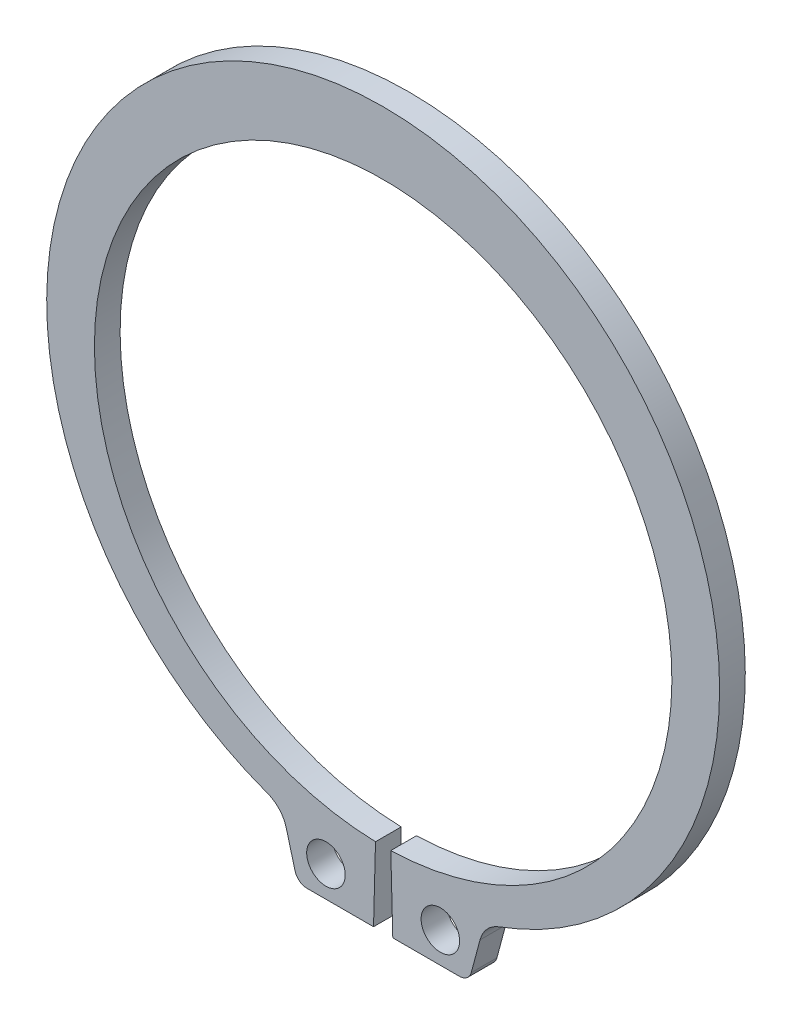
ISO-10303-21;
HEADER;
FILE_DESCRIPTION(('STEP AP214'),'2;1');
FILE_NAME('part.step','',(''),(''),'','','');
FILE_SCHEMA(('AUTOMOTIVE_DESIGN { 1 0 10303 214 1 1 1 1 }'));
ENDSEC;
DATA;
#1=APPLICATION_CONTEXT('core data for automotive mechanical design processes');
#2=APPLICATION_PROTOCOL_DEFINITION('international standard','automotive_design',2000,#1);
#3=PRODUCT_CONTEXT('',#1,'mechanical');
#4=PRODUCT('Part','Part','',(#3));
#5=PRODUCT_RELATED_PRODUCT_CATEGORY('part','',(#4));
#6=PRODUCT_DEFINITION_FORMATION('','',#4);
#7=PRODUCT_DEFINITION_CONTEXT('part definition',#1,'design');
#8=PRODUCT_DEFINITION('design','',#6,#7);
#9=PRODUCT_DEFINITION_SHAPE('','',#8);
#10=(LENGTH_UNIT() NAMED_UNIT(*) SI_UNIT(.MILLI.,.METRE.));
#11=(NAMED_UNIT(*) PLANE_ANGLE_UNIT() SI_UNIT($,.RADIAN.));
#12=(NAMED_UNIT(*) SI_UNIT($,.STERADIAN.) SOLID_ANGLE_UNIT());
#13=UNCERTAINTY_MEASURE_WITH_UNIT(LENGTH_MEASURE(1.E-05),#10,'distance_accuracy_value','');
#14=(GEOMETRIC_REPRESENTATION_CONTEXT(3) GLOBAL_UNCERTAINTY_ASSIGNED_CONTEXT((#13)) GLOBAL_UNIT_ASSIGNED_CONTEXT((#10,
#11,#12)) REPRESENTATION_CONTEXT('',''));
#15=CARTESIAN_POINT('',(0.,0.,0.));
#16=DIRECTION('',(0.,0.,1.));
#17=DIRECTION('',(1.,0.,0.));
#18=AXIS2_PLACEMENT_3D('',#15,#16,#17);
#19=CARTESIAN_POINT('',(3.16619789010669,-15.2103950782661,1.0668));
#20=DIRECTION('',(0.,0.,-1.));
#21=DIRECTION('',(-1.,0.,0.));
#22=AXIS2_PLACEMENT_3D('',#19,#20,#21);
#23=PLANE('',#22);
#24=CARTESIAN_POINT('',(-2.3749,-14.4483950782661,1.0668));
#25=DIRECTION('',(0.,0.,1.));
#26=DIRECTION('',(1.,0.,0.));
#27=AXIS2_PLACEMENT_3D('',#24,#25,#26);
#28=CIRCLE('',#27,0.8001);
#29=CARTESIAN_POINT('',(-1.5748,-14.4483950782661,1.0668));
#30=VERTEX_POINT('',#29);
#31=EDGE_CURVE('E159',#30,#30,#28,.T.);
#32=ORIENTED_EDGE('',*,*,#31,.F.);
#33=EDGE_LOOP('',(#32));
#34=FACE_BOUND('',#33,.T.);
#35=CARTESIAN_POINT('',(3.16619789010669,-15.2103950782661,1.0668));
#36=DIRECTION('',(0.,0.,1.));
#37=DIRECTION('',(-1.,0.,0.));
#38=AXIS2_PLACEMENT_3D('',#35,#36,#37);
#39=CIRCLE('',#38,0.508);
#40=CARTESIAN_POINT('',(3.16619789010669,-15.7183950782661,1.0668));
#41=VERTEX_POINT('',#40);
#42=CARTESIAN_POINT('',(3.65688820986154,-15.3418751531782,1.0668));
#43=VERTEX_POINT('',#42);
#44=EDGE_CURVE('E178',#41,#43,#39,.T.);
#45=ORIENTED_EDGE('',*,*,#44,.T.);
#46=DIRECTION('',(0.258819045102521,0.965925826289068,0.));
#47=VECTOR('',#46,1.);
#48=CARTESIAN_POINT('',(4.02209585040506,-13.9789016833574,1.0668));
#49=LINE('',#48,#47);
#50=CARTESIAN_POINT('',(4.02209585040506,-13.9789016833574,1.0668));
#51=VERTEX_POINT('',#50);
#52=EDGE_CURVE('E106',#43,#51,#49,.T.);
#53=ORIENTED_EDGE('',*,*,#52,.T.);
#54=CARTESIAN_POINT('',(5.24882164979218,-14.3076018706376,1.0668));
#55=DIRECTION('',(0.,0.,-1.));
#56=DIRECTION('',(1.,0.,0.));
#57=AXIS2_PLACEMENT_3D('',#54,#55,#56);
#58=CIRCLE('',#57,1.27);
#59=CARTESIAN_POINT('',(4.81141984564283,-13.1153017147511,1.0668));
#60=VERTEX_POINT('',#59);
#61=EDGE_CURVE('E205',#51,#60,#58,.T.);
#62=ORIENTED_EDGE('',*,*,#61,.T.);
#63=CARTESIAN_POINT('',(0.,0.,1.0668));
#64=DIRECTION('',(0.,0.,1.));
#65=DIRECTION('',(1.,0.,0.));
#66=AXIS2_PLACEMENT_3D('',#63,#64,#65);
#67=CIRCLE('',#66,13.97);
#68=CARTESIAN_POINT('',(-4.81141984564284,-13.1153017147511,1.0668));
#69=VERTEX_POINT('',#68);
#70=EDGE_CURVE('E224',#60,#69,#67,.T.);
#71=ORIENTED_EDGE('',*,*,#70,.T.);
#72=CARTESIAN_POINT('',(-5.24882164979217,-14.3076018706376,1.0668));
#73=DIRECTION('',(0.,0.,-1.));
#74=DIRECTION('',(-1.,0.,0.));
#75=AXIS2_PLACEMENT_3D('',#72,#73,#74);
#76=CIRCLE('',#75,1.27);
#77=CARTESIAN_POINT('',(-4.02209585040505,-13.9789016833574,1.0668));
#78=VERTEX_POINT('',#77);
#79=EDGE_CURVE('E221',#69,#78,#76,.T.);
#80=ORIENTED_EDGE('',*,*,#79,.T.);
#81=DIRECTION('',(0.258819045102521,-0.965925826289068,0.));
#82=VECTOR('',#81,1.);
#83=CARTESIAN_POINT('',(-4.02209585040505,-13.9789016833574,1.0668));
#84=LINE('',#83,#82);
#85=CARTESIAN_POINT('',(-3.65688820986153,-15.3418751531782,1.0668));
#86=VERTEX_POINT('',#85);
#87=EDGE_CURVE('E223',#78,#86,#84,.T.);
#88=ORIENTED_EDGE('',*,*,#87,.T.);
#89=CARTESIAN_POINT('',(-3.16619789010669,-15.2103950782661,1.0668));
#90=DIRECTION('',(0.,0.,1.));
#91=DIRECTION('',(1.,0.,0.));
#92=AXIS2_PLACEMENT_3D('',#89,#90,#91);
#93=CIRCLE('',#92,0.508000000000001);
#94=CARTESIAN_POINT('',(-3.16619789010669,-15.7183950782661,1.0668));
#95=VERTEX_POINT('',#94);
#96=EDGE_CURVE('E226',#86,#95,#93,.T.);
#97=ORIENTED_EDGE('',*,*,#96,.T.);
#98=DIRECTION('',(1.,0.,0.));
#99=VECTOR('',#98,1.);
#100=CARTESIAN_POINT('',(-3.16619789010669,-15.7183950782661,1.0668));
#101=LINE('',#100,#99);
#102=CARTESIAN_POINT('',(-0.399594471575783,-15.7183950782661,1.0668));
#103=VERTEX_POINT('',#102);
#104=EDGE_CURVE('E232',#95,#103,#101,.T.);
#105=ORIENTED_EDGE('',*,*,#104,.T.);
#106=DIRECTION('',(0.0264830508474575,0.999649262500509,0.));
#107=VECTOR('',#106,1.);
#108=CARTESIAN_POINT('',(-0.317499999999999,-12.6195950782661,1.0668));
#109=LINE('',#108,#107);
#110=CARTESIAN_POINT('',(-0.317499999999999,-12.6195950782661,1.0668));
#111=VERTEX_POINT('',#110);
#112=EDGE_CURVE('E137',#103,#111,#109,.T.);
#113=ORIENTED_EDGE('',*,*,#112,.T.);
#114=CARTESIAN_POINT('',(0.,-0.635,1.0668));
#115=DIRECTION('',(0.,0.,-1.));
#116=DIRECTION('',(1.,0.,0.));
#117=AXIS2_PLACEMENT_3D('',#114,#115,#116);
#118=CIRCLE('',#117,11.9888);
#119=CARTESIAN_POINT('',(0.317499999999996,-12.6195950782661,1.0668));
#120=VERTEX_POINT('',#119);
#121=EDGE_CURVE('E131',#111,#120,#118,.T.);
#122=ORIENTED_EDGE('',*,*,#121,.T.);
#123=DIRECTION('',(0.0264830508474578,-0.999649262500509,0.));
#124=VECTOR('',#123,1.);
#125=CARTESIAN_POINT('',(0.317500000000002,-12.6195950782661,1.0668));
#126=LINE('',#125,#124);
#127=CARTESIAN_POINT('',(0.399594471575787,-15.7183950782661,1.0668));
#128=VERTEX_POINT('',#127);
#129=EDGE_CURVE('E135',#120,#128,#126,.T.);
#130=ORIENTED_EDGE('',*,*,#129,.T.);
#131=DIRECTION('',(1.,0.,0.));
#132=VECTOR('',#131,1.);
#133=CARTESIAN_POINT('',(3.16619789010669,-15.7183950782661,1.0668));
#134=LINE('',#133,#132);
#135=EDGE_CURVE('E51',#128,#41,#134,.T.);
#136=ORIENTED_EDGE('',*,*,#135,.T.);
#137=EDGE_LOOP('',(#45,#53,#62,#71,#80,#88,#97,#105,#113,#122,#130,#136));
#138=FACE_BOUND('',#137,.T.);
#139=CARTESIAN_POINT('',(2.3749,-14.4483950782661,1.0668));
#140=DIRECTION('',(0.,0.,1.));
#141=DIRECTION('',(1.,0.,0.));
#142=AXIS2_PLACEMENT_3D('',#139,#140,#141);
#143=CIRCLE('',#142,0.800099999999999);
#144=CARTESIAN_POINT('',(3.175,-14.4483950782661,1.0668));
#145=VERTEX_POINT('',#144);
#146=EDGE_CURVE('E275',#145,#145,#143,.T.);
#147=ORIENTED_EDGE('',*,*,#146,.F.);
#148=EDGE_LOOP('',(#147));
#149=FACE_BOUND('',#148,.T.);
#150=ADVANCED_FACE('F34',(#34,#138,#149),#23,.F.);
#151=CARTESIAN_POINT('',(3.16619789010669,-15.2103950782661,0.));
#152=DIRECTION('',(0.,0.,-1.));
#153=DIRECTION('',(-1.,0.,0.));
#154=AXIS2_PLACEMENT_3D('',#151,#152,#153);
#155=PLANE('',#154);
#156=CARTESIAN_POINT('',(-2.3749,-14.4483950782661,0.));
#157=DIRECTION('',(0.,0.,1.));
#158=DIRECTION('',(1.,0.,0.));
#159=AXIS2_PLACEMENT_3D('',#156,#157,#158);
#160=CIRCLE('',#159,0.8001);
#161=CARTESIAN_POINT('',(-1.5748,-14.4483950782661,0.));
#162=VERTEX_POINT('',#161);
#163=EDGE_CURVE('E280',#162,#162,#160,.T.);
#164=ORIENTED_EDGE('',*,*,#163,.T.);
#165=EDGE_LOOP('',(#164));
#166=FACE_BOUND('',#165,.T.);
#167=CARTESIAN_POINT('',(3.16619789010669,-15.2103950782661,0.));
#168=DIRECTION('',(0.,0.,1.));
#169=DIRECTION('',(-1.,0.,0.));
#170=AXIS2_PLACEMENT_3D('',#167,#168,#169);
#171=CIRCLE('',#170,0.508);
#172=CARTESIAN_POINT('',(3.16619789010669,-15.7183950782661,0.));
#173=VERTEX_POINT('',#172);
#174=CARTESIAN_POINT('',(3.65688820986154,-15.3418751531782,0.));
#175=VERTEX_POINT('',#174);
#176=EDGE_CURVE('E155',#173,#175,#171,.T.);
#177=ORIENTED_EDGE('',*,*,#176,.F.);
#178=DIRECTION('',(1.,0.,0.));
#179=VECTOR('',#178,1.);
#180=CARTESIAN_POINT('',(3.16619789010669,-15.7183950782661,0.));
#181=LINE('',#180,#179);
#182=CARTESIAN_POINT('',(0.399594471575787,-15.7183950782661,0.));
#183=VERTEX_POINT('',#182);
#184=EDGE_CURVE('E98',#183,#173,#181,.T.);
#185=ORIENTED_EDGE('',*,*,#184,.F.);
#186=DIRECTION('',(0.0264830508474578,-0.999649262500509,0.));
#187=VECTOR('',#186,1.);
#188=CARTESIAN_POINT('',(0.317500000000002,-12.6195950782661,0.));
#189=LINE('',#188,#187);
#190=CARTESIAN_POINT('',(0.317499999999996,-12.6195950782661,0.));
#191=VERTEX_POINT('',#190);
#192=EDGE_CURVE('E92',#191,#183,#189,.T.);
#193=ORIENTED_EDGE('',*,*,#192,.F.);
#194=CARTESIAN_POINT('',(0.,-0.635,0.));
#195=DIRECTION('',(0.,0.,-1.));
#196=DIRECTION('',(1.,0.,0.));
#197=AXIS2_PLACEMENT_3D('',#194,#195,#196);
#198=CIRCLE('',#197,11.9888);
#199=CARTESIAN_POINT('',(-0.317499999999999,-12.6195950782661,0.));
#200=VERTEX_POINT('',#199);
#201=EDGE_CURVE('E145',#200,#191,#198,.T.);
#202=ORIENTED_EDGE('',*,*,#201,.F.);
#203=DIRECTION('',(0.0264830508474575,0.999649262500509,0.));
#204=VECTOR('',#203,1.);
#205=CARTESIAN_POINT('',(-0.317499999999999,-12.6195950782661,0.));
#206=LINE('',#205,#204);
#207=CARTESIAN_POINT('',(-0.399594471575783,-15.7183950782661,0.));
#208=VERTEX_POINT('',#207);
#209=EDGE_CURVE('E173',#208,#200,#206,.T.);
#210=ORIENTED_EDGE('',*,*,#209,.F.);
#211=DIRECTION('',(1.,0.,0.));
#212=VECTOR('',#211,1.);
#213=CARTESIAN_POINT('',(-3.16619789010669,-15.7183950782661,0.));
#214=LINE('',#213,#212);
#215=CARTESIAN_POINT('',(-3.16619789010669,-15.7183950782661,0.));
#216=VERTEX_POINT('',#215);
#217=EDGE_CURVE('E171',#216,#208,#214,.T.);
#218=ORIENTED_EDGE('',*,*,#217,.F.);
#219=CARTESIAN_POINT('',(-3.16619789010669,-15.2103950782661,0.));
#220=DIRECTION('',(0.,0.,1.));
#221=DIRECTION('',(1.,0.,0.));
#222=AXIS2_PLACEMENT_3D('',#219,#220,#221);
#223=CIRCLE('',#222,0.508000000000001);
#224=CARTESIAN_POINT('',(-3.65688820986153,-15.3418751531782,0.));
#225=VERTEX_POINT('',#224);
#226=EDGE_CURVE('E169',#225,#216,#223,.T.);
#227=ORIENTED_EDGE('',*,*,#226,.F.);
#228=DIRECTION('',(0.258819045102521,-0.965925826289068,0.));
#229=VECTOR('',#228,1.);
#230=CARTESIAN_POINT('',(-4.02209585040505,-13.9789016833574,0.));
#231=LINE('',#230,#229);
#232=CARTESIAN_POINT('',(-4.02209585040505,-13.9789016833574,0.));
#233=VERTEX_POINT('',#232);
#234=EDGE_CURVE('E167',#233,#225,#231,.T.);
#235=ORIENTED_EDGE('',*,*,#234,.F.);
#236=CARTESIAN_POINT('',(-5.24882164979217,-14.3076018706376,0.));
#237=DIRECTION('',(0.,0.,-1.));
#238=DIRECTION('',(-1.,0.,0.));
#239=AXIS2_PLACEMENT_3D('',#236,#237,#238);
#240=CIRCLE('',#239,1.27);
#241=CARTESIAN_POINT('',(-4.81141984564284,-13.1153017147511,0.));
#242=VERTEX_POINT('',#241);
#243=EDGE_CURVE('E165',#242,#233,#240,.T.);
#244=ORIENTED_EDGE('',*,*,#243,.F.);
#245=CARTESIAN_POINT('',(0.,0.,0.));
#246=DIRECTION('',(0.,0.,1.));
#247=DIRECTION('',(1.,0.,0.));
#248=AXIS2_PLACEMENT_3D('',#245,#246,#247);
#249=CIRCLE('',#248,13.97);
#250=CARTESIAN_POINT('',(4.81141984564283,-13.1153017147511,0.));
#251=VERTEX_POINT('',#250);
#252=EDGE_CURVE('E163',#251,#242,#249,.T.);
#253=ORIENTED_EDGE('',*,*,#252,.F.);
#254=CARTESIAN_POINT('',(5.24882164979218,-14.3076018706376,0.));
#255=DIRECTION('',(0.,0.,-1.));
#256=DIRECTION('',(1.,0.,0.));
#257=AXIS2_PLACEMENT_3D('',#254,#255,#256);
#258=CIRCLE('',#257,1.27);
#259=CARTESIAN_POINT('',(4.02209585040506,-13.9789016833574,0.));
#260=VERTEX_POINT('',#259);
#261=EDGE_CURVE('E161',#260,#251,#258,.T.);
#262=ORIENTED_EDGE('',*,*,#261,.F.);
#263=DIRECTION('',(0.258819045102521,0.965925826289068,0.));
#264=VECTOR('',#263,1.);
#265=CARTESIAN_POINT('',(4.02209585040506,-13.9789016833574,0.));
#266=LINE('',#265,#264);
#267=EDGE_CURVE('E158',#175,#260,#266,.T.);
#268=ORIENTED_EDGE('',*,*,#267,.F.);
#269=EDGE_LOOP('',(#177,#185,#193,#202,#210,#218,#227,#235,#244,#253,#262,#268));
#270=FACE_BOUND('',#269,.T.);
#271=CARTESIAN_POINT('',(2.3749,-14.4483950782661,0.));
#272=DIRECTION('',(0.,0.,1.));
#273=DIRECTION('',(1.,0.,0.));
#274=AXIS2_PLACEMENT_3D('',#271,#272,#273);
#275=CIRCLE('',#274,0.800099999999999);
#276=CARTESIAN_POINT('',(3.175,-14.4483950782661,0.));
#277=VERTEX_POINT('',#276);
#278=EDGE_CURVE('E278',#277,#277,#275,.T.);
#279=ORIENTED_EDGE('',*,*,#278,.T.);
#280=EDGE_LOOP('',(#279));
#281=FACE_BOUND('',#280,.T.);
#282=ADVANCED_FACE('F209',(#166,#270,#281),#155,.T.);
#283=CARTESIAN_POINT('',(3.16619789010669,-15.2103950782661,1.0668));
#284=DIRECTION('',(0.,0.,-1.));
#285=DIRECTION('',(-1.,0.,0.));
#286=AXIS2_PLACEMENT_3D('',#283,#284,#285);
#287=CYLINDRICAL_SURFACE('',#286,0.508);
#288=ORIENTED_EDGE('',*,*,#176,.T.);
#289=DIRECTION('',(0.,0.,-1.));
#290=VECTOR('',#289,1.);
#291=CARTESIAN_POINT('',(3.65688820986154,-15.3418751531782,1.0668));
#292=LINE('',#291,#290);
#293=EDGE_CURVE('E11',#43,#175,#292,.T.);
#294=ORIENTED_EDGE('',*,*,#293,.F.);
#295=ORIENTED_EDGE('',*,*,#44,.F.);
#296=DIRECTION('',(0.,0.,-1.));
#297=VECTOR('',#296,1.);
#298=CARTESIAN_POINT('',(3.16619789010669,-15.7183950782661,1.0668));
#299=LINE('',#298,#297);
#300=EDGE_CURVE('E151',#41,#173,#299,.T.);
#301=ORIENTED_EDGE('',*,*,#300,.T.);
#302=EDGE_LOOP('',(#288,#294,#295,#301));
#303=FACE_BOUND('',#302,.T.);
#304=ADVANCED_FACE('F36',(#303),#287,.T.);
#305=CARTESIAN_POINT('',(4.02209585040506,-13.9789016833574,1.0668));
#306=DIRECTION('',(-0.965925826289068,0.258819045102521,0.));
#307=DIRECTION('',(-0.258819045102521,-0.965925826289068,0.));
#308=AXIS2_PLACEMENT_3D('',#305,#306,#307);
#309=PLANE('',#308);
#310=ORIENTED_EDGE('',*,*,#267,.T.);
#311=DIRECTION('',(0.,0.,-1.));
#312=VECTOR('',#311,1.);
#313=CARTESIAN_POINT('',(4.02209585040506,-13.9789016833574,1.0668));
#314=LINE('',#313,#312);
#315=EDGE_CURVE('E43',#51,#260,#314,.T.);
#316=ORIENTED_EDGE('',*,*,#315,.F.);
#317=ORIENTED_EDGE('',*,*,#52,.F.);
#318=ORIENTED_EDGE('',*,*,#293,.T.);
#319=EDGE_LOOP('',(#310,#316,#317,#318));
#320=FACE_BOUND('',#319,.T.);
#321=ADVANCED_FACE('F373',(#320),#309,.F.);
#322=CARTESIAN_POINT('',(5.24882164979218,-14.3076018706376,1.0668));
#323=DIRECTION('',(0.,0.,-1.));
#324=DIRECTION('',(-1.,0.,0.));
#325=AXIS2_PLACEMENT_3D('',#322,#323,#324);
#326=CYLINDRICAL_SURFACE('',#325,1.27);
#327=ORIENTED_EDGE('',*,*,#261,.T.);
#328=DIRECTION('',(0.,0.,-1.));
#329=VECTOR('',#328,1.);
#330=CARTESIAN_POINT('',(4.81141984564283,-13.1153017147511,1.0668));
#331=LINE('',#330,#329);
#332=EDGE_CURVE('E197',#60,#251,#331,.T.);
#333=ORIENTED_EDGE('',*,*,#332,.F.);
#334=ORIENTED_EDGE('',*,*,#61,.F.);
#335=ORIENTED_EDGE('',*,*,#315,.T.);
#336=EDGE_LOOP('',(#327,#333,#334,#335));
#337=FACE_BOUND('',#336,.T.);
#338=ADVANCED_FACE('F203',(#337),#326,.F.);
#339=CARTESIAN_POINT('',(0.,0.,1.0668));
#340=DIRECTION('',(0.,0.,-1.));
#341=DIRECTION('',(-1.,0.,0.));
#342=AXIS2_PLACEMENT_3D('',#339,#340,#341);
#343=CYLINDRICAL_SURFACE('',#342,13.97);
#344=ORIENTED_EDGE('',*,*,#252,.T.);
#345=DIRECTION('',(0.,0.,-1.));
#346=VECTOR('',#345,1.);
#347=CARTESIAN_POINT('',(-4.81141984564284,-13.1153017147511,1.0668));
#348=LINE('',#347,#346);
#349=EDGE_CURVE('E194',#69,#242,#348,.T.);
#350=ORIENTED_EDGE('',*,*,#349,.F.);
#351=ORIENTED_EDGE('',*,*,#70,.F.);
#352=ORIENTED_EDGE('',*,*,#332,.T.);
#353=EDGE_LOOP('',(#344,#350,#351,#352));
#354=FACE_BOUND('',#353,.T.);
#355=ADVANCED_FACE('F215',(#354),#343,.T.);
#356=CARTESIAN_POINT('',(-5.24882164979217,-14.3076018706376,1.0668));
#357=DIRECTION('',(0.,0.,-1.));
#358=DIRECTION('',(-1.,0.,0.));
#359=AXIS2_PLACEMENT_3D('',#356,#357,#358);
#360=CYLINDRICAL_SURFACE('',#359,1.27);
#361=ORIENTED_EDGE('',*,*,#243,.T.);
#362=DIRECTION('',(0.,0.,-1.));
#363=VECTOR('',#362,1.);
#364=CARTESIAN_POINT('',(-4.02209585040505,-13.9789016833574,1.0668));
#365=LINE('',#364,#363);
#366=EDGE_CURVE('E191',#78,#233,#365,.T.);
#367=ORIENTED_EDGE('',*,*,#366,.F.);
#368=ORIENTED_EDGE('',*,*,#79,.F.);
#369=ORIENTED_EDGE('',*,*,#349,.T.);
#370=EDGE_LOOP('',(#361,#367,#368,#369));
#371=FACE_BOUND('',#370,.T.);
#372=ADVANCED_FACE('F219',(#371),#360,.F.);
#373=CARTESIAN_POINT('',(-4.02209585040505,-13.9789016833574,1.0668));
#374=DIRECTION('',(0.965925826289068,0.258819045102521,0.));
#375=DIRECTION('',(-0.258819045102521,0.965925826289068,0.));
#376=AXIS2_PLACEMENT_3D('',#373,#374,#375);
#377=PLANE('',#376);
#378=ORIENTED_EDGE('',*,*,#234,.T.);
#379=DIRECTION('',(0.,0.,-1.));
#380=VECTOR('',#379,1.);
#381=CARTESIAN_POINT('',(-3.65688820986153,-15.3418751531782,1.0668));
#382=LINE('',#381,#380);
#383=EDGE_CURVE('E188',#86,#225,#382,.T.);
#384=ORIENTED_EDGE('',*,*,#383,.F.);
#385=ORIENTED_EDGE('',*,*,#87,.F.);
#386=ORIENTED_EDGE('',*,*,#366,.T.);
#387=EDGE_LOOP('',(#378,#384,#385,#386));
#388=FACE_BOUND('',#387,.T.);
#389=ADVANCED_FACE('F338',(#388),#377,.F.);
#390=CARTESIAN_POINT('',(-3.16619789010669,-15.2103950782661,1.0668));
#391=DIRECTION('',(0.,0.,-1.));
#392=DIRECTION('',(-1.,0.,0.));
#393=AXIS2_PLACEMENT_3D('',#390,#391,#392);
#394=CYLINDRICAL_SURFACE('',#393,0.508000000000001);
#395=ORIENTED_EDGE('',*,*,#226,.T.);
#396=DIRECTION('',(0.,0.,-1.));
#397=VECTOR('',#396,1.);
#398=CARTESIAN_POINT('',(-3.16619789010669,-15.7183950782661,1.0668));
#399=LINE('',#398,#397);
#400=EDGE_CURVE('E185',#95,#216,#399,.T.);
#401=ORIENTED_EDGE('',*,*,#400,.F.);
#402=ORIENTED_EDGE('',*,*,#96,.F.);
#403=ORIENTED_EDGE('',*,*,#383,.T.);
#404=EDGE_LOOP('',(#395,#401,#402,#403));
#405=FACE_BOUND('',#404,.T.);
#406=ADVANCED_FACE('F329',(#405),#394,.T.);
#407=CARTESIAN_POINT('',(-3.16619789010669,-15.7183950782661,1.0668));
#408=DIRECTION('',(0.,1.,0.));
#409=DIRECTION('',(0.,0.,1.));
#410=AXIS2_PLACEMENT_3D('',#407,#408,#409);
#411=PLANE('',#410);
#412=ORIENTED_EDGE('',*,*,#217,.T.);
#413=DIRECTION('',(0.,0.,-1.));
#414=VECTOR('',#413,1.);
#415=CARTESIAN_POINT('',(-0.399594471575783,-15.7183950782661,1.0668));
#416=LINE('',#415,#414);
#417=EDGE_CURVE('E182',#103,#208,#416,.T.);
#418=ORIENTED_EDGE('',*,*,#417,.F.);
#419=ORIENTED_EDGE('',*,*,#104,.F.);
#420=ORIENTED_EDGE('',*,*,#400,.T.);
#421=EDGE_LOOP('',(#412,#418,#419,#420));
#422=FACE_BOUND('',#421,.T.);
#423=ADVANCED_FACE('F238',(#422),#411,.F.);
#424=CARTESIAN_POINT('',(-0.317499999999999,-12.6195950782661,1.0668));
#425=DIRECTION('',(-0.999649262500509,0.0264830508474575,0.));
#426=DIRECTION('',(-0.0264830508474575,-0.999649262500509,0.));
#427=AXIS2_PLACEMENT_3D('',#424,#425,#426);
#428=PLANE('',#427);
#429=ORIENTED_EDGE('',*,*,#209,.T.);
#430=DIRECTION('',(0.,0.,-1.));
#431=VECTOR('',#430,1.);
#432=CARTESIAN_POINT('',(-0.317499999999999,-12.6195950782661,1.0668));
#433=LINE('',#432,#431);
#434=EDGE_CURVE('E146',#111,#200,#433,.T.);
#435=ORIENTED_EDGE('',*,*,#434,.F.);
#436=ORIENTED_EDGE('',*,*,#112,.F.);
#437=ORIENTED_EDGE('',*,*,#417,.T.);
#438=EDGE_LOOP('',(#429,#435,#436,#437));
#439=FACE_BOUND('',#438,.T.);
#440=ADVANCED_FACE('F242',(#439),#428,.F.);
#441=CARTESIAN_POINT('',(0.,-0.635,1.0668));
#442=DIRECTION('',(0.,0.,-1.));
#443=DIRECTION('',(-1.,0.,0.));
#444=AXIS2_PLACEMENT_3D('',#441,#442,#443);
#445=CYLINDRICAL_SURFACE('',#444,11.9888);
#446=ORIENTED_EDGE('',*,*,#201,.T.);
#447=DIRECTION('',(0.,0.,-1.));
#448=VECTOR('',#447,1.);
#449=CARTESIAN_POINT('',(0.317499999999996,-12.6195950782661,1.0668));
#450=LINE('',#449,#448);
#451=EDGE_CURVE('E142',#120,#191,#450,.T.);
#452=ORIENTED_EDGE('',*,*,#451,.F.);
#453=ORIENTED_EDGE('',*,*,#121,.F.);
#454=ORIENTED_EDGE('',*,*,#434,.T.);
#455=EDGE_LOOP('',(#446,#452,#453,#454));
#456=FACE_BOUND('',#455,.T.);
#457=ADVANCED_FACE('F143',(#456),#445,.F.);
#458=CARTESIAN_POINT('',(0.317500000000002,-12.6195950782661,1.0668));
#459=DIRECTION('',(0.999649262500509,0.0264830508474578,0.));
#460=DIRECTION('',(-0.0264830508474578,0.999649262500509,0.));
#461=AXIS2_PLACEMENT_3D('',#458,#459,#460);
#462=PLANE('',#461);
#463=ORIENTED_EDGE('',*,*,#192,.T.);
#464=DIRECTION('',(0.,0.,-1.));
#465=VECTOR('',#464,1.);
#466=CARTESIAN_POINT('',(0.399594471575787,-15.7183950782661,1.0668));
#467=LINE('',#466,#465);
#468=EDGE_CURVE('E147',#128,#183,#467,.T.);
#469=ORIENTED_EDGE('',*,*,#468,.F.);
#470=ORIENTED_EDGE('',*,*,#129,.F.);
#471=ORIENTED_EDGE('',*,*,#451,.T.);
#472=EDGE_LOOP('',(#463,#469,#470,#471));
#473=FACE_BOUND('',#472,.T.);
#474=ADVANCED_FACE('F149',(#473),#462,.F.);
#475=CARTESIAN_POINT('',(3.16619789010669,-15.7183950782661,1.0668));
#476=DIRECTION('',(0.,1.,0.));
#477=DIRECTION('',(0.,0.,1.));
#478=AXIS2_PLACEMENT_3D('',#475,#476,#477);
#479=PLANE('',#478);
#480=ORIENTED_EDGE('',*,*,#184,.T.);
#481=ORIENTED_EDGE('',*,*,#300,.F.);
#482=ORIENTED_EDGE('',*,*,#135,.F.);
#483=ORIENTED_EDGE('',*,*,#468,.T.);
#484=EDGE_LOOP('',(#480,#481,#482,#483));
#485=FACE_BOUND('',#484,.T.);
#486=ADVANCED_FACE('F246',(#485),#479,.F.);
#487=CARTESIAN_POINT('',(-2.3749,-14.4483950782661,1.0668));
#488=DIRECTION('',(0.,0.,-1.));
#489=DIRECTION('',(-1.,0.,0.));
#490=AXIS2_PLACEMENT_3D('',#487,#488,#489);
#491=CYLINDRICAL_SURFACE('',#490,0.8001);
#492=ORIENTED_EDGE('',*,*,#31,.T.);
#493=EDGE_LOOP('',(#492));
#494=FACE_BOUND('',#493,.T.);
#495=ORIENTED_EDGE('',*,*,#163,.F.);
#496=EDGE_LOOP('',(#495));
#497=FACE_BOUND('',#496,.T.);
#498=ADVANCED_FACE('F248',(#494,#497),#491,.F.);
#499=CARTESIAN_POINT('',(2.3749,-14.4483950782661,1.0668));
#500=DIRECTION('',(0.,0.,-1.));
#501=DIRECTION('',(-1.,0.,0.));
#502=AXIS2_PLACEMENT_3D('',#499,#500,#501);
#503=CYLINDRICAL_SURFACE('',#502,0.800099999999999);
#504=ORIENTED_EDGE('',*,*,#146,.T.);
#505=EDGE_LOOP('',(#504));
#506=FACE_BOUND('',#505,.T.);
#507=ORIENTED_EDGE('',*,*,#278,.F.);
#508=EDGE_LOOP('',(#507));
#509=FACE_BOUND('',#508,.T.);
#510=ADVANCED_FACE('F254',(#506,#509),#503,.F.);
#511=CLOSED_SHELL('',(#150,#282,#304,#321,#338,#355,#372,#389,#406,#423,#440,#457,#474,#486,
#498,#510));
#512=MANIFOLD_SOLID_BREP('B2',#511);
#513=ADVANCED_BREP_SHAPE_REPRESENTATION('',(#18,#512),#14);
#514=SHAPE_DEFINITION_REPRESENTATION(#9,#513);
ENDSEC;
END-ISO-10303-21;
